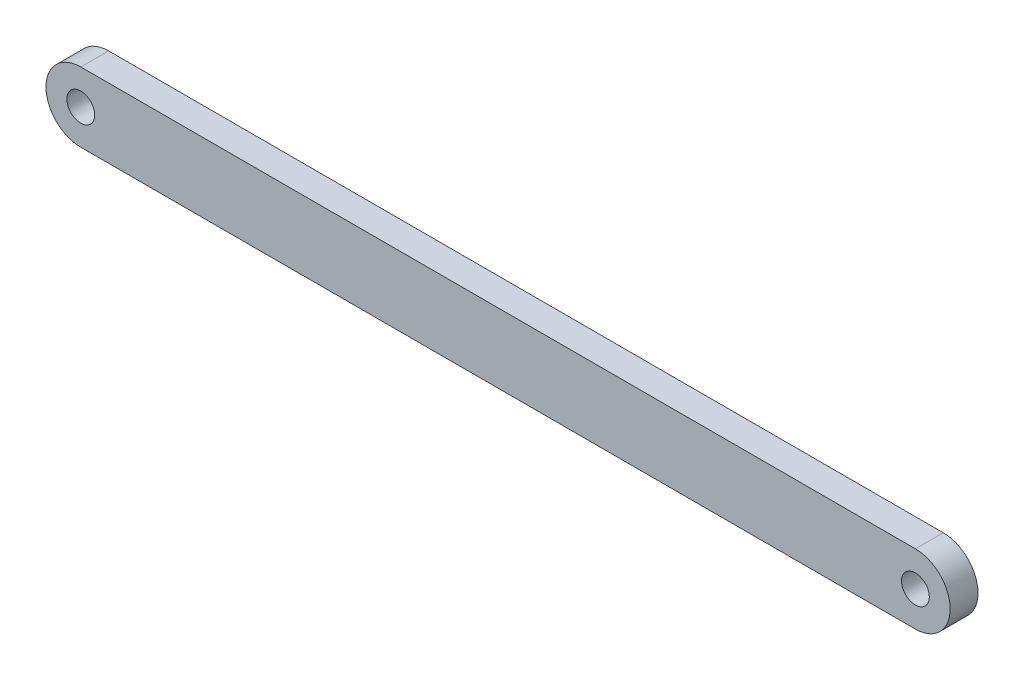
ISO-10303-21;
HEADER;
FILE_DESCRIPTION(('STEP AP214'),'2;1');
FILE_NAME('part.step','',(''),(''),'','','');
FILE_SCHEMA(('AUTOMOTIVE_DESIGN { 1 0 10303 214 1 1 1 1 }'));
ENDSEC;
DATA;
#1=APPLICATION_CONTEXT('core data for automotive mechanical design processes');
#2=APPLICATION_PROTOCOL_DEFINITION('international standard','automotive_design',2000,#1);
#3=PRODUCT_CONTEXT('',#1,'mechanical');
#4=PRODUCT('Part','Part','',(#3));
#5=PRODUCT_RELATED_PRODUCT_CATEGORY('part','',(#4));
#6=PRODUCT_DEFINITION_FORMATION('','',#4);
#7=PRODUCT_DEFINITION_CONTEXT('part definition',#1,'design');
#8=PRODUCT_DEFINITION('design','',#6,#7);
#9=PRODUCT_DEFINITION_SHAPE('','',#8);
#10=(LENGTH_UNIT() NAMED_UNIT(*) SI_UNIT(.MILLI.,.METRE.));
#11=(NAMED_UNIT(*) PLANE_ANGLE_UNIT() SI_UNIT($,.RADIAN.));
#12=(NAMED_UNIT(*) SI_UNIT($,.STERADIAN.) SOLID_ANGLE_UNIT());
#13=UNCERTAINTY_MEASURE_WITH_UNIT(LENGTH_MEASURE(1.E-05),#10,'distance_accuracy_value','');
#14=(GEOMETRIC_REPRESENTATION_CONTEXT(3) GLOBAL_UNCERTAINTY_ASSIGNED_CONTEXT((#13)) GLOBAL_UNIT_ASSIGNED_CONTEXT((#10,
#11,#12)) REPRESENTATION_CONTEXT('',''));
#15=CARTESIAN_POINT('',(0.,0.,0.));
#16=DIRECTION('',(0.,0.,1.));
#17=DIRECTION('',(1.,0.,0.));
#18=AXIS2_PLACEMENT_3D('',#15,#16,#17);
#19=CARTESIAN_POINT('',(-60.0000000000001,0.,4.));
#20=DIRECTION('',(0.,0.,-1.));
#21=DIRECTION('',(-1.,0.,0.));
#22=AXIS2_PLACEMENT_3D('',#19,#20,#21);
#23=CYLINDRICAL_SURFACE('',#22,4.99999999999996);
#24=CARTESIAN_POINT('',(-60.0000000000001,0.,0.));
#25=DIRECTION('',(0.,0.,1.));
#26=DIRECTION('',(1.,0.,0.));
#27=AXIS2_PLACEMENT_3D('',#24,#25,#26);
#28=CIRCLE('',#27,4.99999999999996);
#29=CARTESIAN_POINT('',(-60.0000000000001,4.99999999999996,0.));
#30=VERTEX_POINT('',#29);
#31=CARTESIAN_POINT('',(-60.0000000000001,-4.99999999999996,0.));
#32=VERTEX_POINT('',#31);
#33=EDGE_CURVE('E109',#30,#32,#28,.T.);
#34=ORIENTED_EDGE('',*,*,#33,.T.);
#35=DIRECTION('',(0.,0.,-1.));
#36=VECTOR('',#35,1.);
#37=CARTESIAN_POINT('',(-60.0000000000001,-4.99999999999996,4.));
#38=LINE('',#37,#36);
#39=CARTESIAN_POINT('',(-60.0000000000001,-4.99999999999996,4.));
#40=VERTEX_POINT('',#39);
#41=EDGE_CURVE('E11',#40,#32,#38,.T.);
#42=ORIENTED_EDGE('',*,*,#41,.F.);
#43=CARTESIAN_POINT('',(-60.0000000000001,0.,4.));
#44=DIRECTION('',(0.,0.,1.));
#45=DIRECTION('',(1.,0.,0.));
#46=AXIS2_PLACEMENT_3D('',#43,#44,#45);
#47=CIRCLE('',#46,4.99999999999996);
#48=CARTESIAN_POINT('',(-60.0000000000001,4.99999999999996,4.));
#49=VERTEX_POINT('',#48);
#50=EDGE_CURVE('E79',#49,#40,#47,.T.);
#51=ORIENTED_EDGE('',*,*,#50,.F.);
#52=DIRECTION('',(0.,0.,-1.));
#53=VECTOR('',#52,1.);
#54=CARTESIAN_POINT('',(-60.0000000000001,4.99999999999996,4.));
#55=LINE('',#54,#53);
#56=EDGE_CURVE('E105',#49,#30,#55,.T.);
#57=ORIENTED_EDGE('',*,*,#56,.T.);
#58=EDGE_LOOP('',(#34,#42,#51,#57));
#59=FACE_BOUND('',#58,.T.);
#60=ADVANCED_FACE('F36',(#59),#23,.T.);
#61=CARTESIAN_POINT('',(0.,-4.99999999999992,4.));
#62=DIRECTION('',(0.,-1.,0.));
#63=DIRECTION('',(1.,0.,0.));
#64=AXIS2_PLACEMENT_3D('',#61,#62,#63);
#65=PLANE('',#64);
#66=DIRECTION('',(-1.,0.,0.));
#67=VECTOR('',#66,1.);
#68=CARTESIAN_POINT('',(0.,-4.99999999999992,0.));
#69=LINE('',#68,#67);
#70=CARTESIAN_POINT('',(59.9999999999999,-4.99999999999989,0.));
#71=VERTEX_POINT('',#70);
#72=EDGE_CURVE('E89',#71,#32,#69,.T.);
#73=ORIENTED_EDGE('',*,*,#72,.F.);
#74=DIRECTION('',(0.,0.,-1.));
#75=VECTOR('',#74,1.);
#76=CARTESIAN_POINT('',(59.9999999999999,-4.99999999999989,4.));
#77=LINE('',#76,#75);
#78=CARTESIAN_POINT('',(59.9999999999999,-4.99999999999989,4.));
#79=VERTEX_POINT('',#78);
#80=EDGE_CURVE('E45',#79,#71,#77,.T.);
#81=ORIENTED_EDGE('',*,*,#80,.F.);
#82=DIRECTION('',(-1.,0.,0.));
#83=VECTOR('',#82,1.);
#84=CARTESIAN_POINT('',(0.,-4.99999999999992,4.));
#85=LINE('',#84,#83);
#86=EDGE_CURVE('E87',#79,#40,#85,.T.);
#87=ORIENTED_EDGE('',*,*,#86,.T.);
#88=ORIENTED_EDGE('',*,*,#41,.T.);
#89=EDGE_LOOP('',(#73,#81,#87,#88));
#90=FACE_BOUND('',#89,.T.);
#91=ADVANCED_FACE('F86',(#90),#65,.T.);
#92=CARTESIAN_POINT('',(59.9999999999999,0.,4.));
#93=DIRECTION('',(0.,0.,-1.));
#94=DIRECTION('',(-1.,0.,0.));
#95=AXIS2_PLACEMENT_3D('',#92,#93,#94);
#96=CYLINDRICAL_SURFACE('',#95,4.99999999999995);
#97=CARTESIAN_POINT('',(59.9999999999999,0.,0.));
#98=DIRECTION('',(0.,0.,1.));
#99=DIRECTION('',(1.,0.,0.));
#100=AXIS2_PLACEMENT_3D('',#97,#98,#99);
#101=CIRCLE('',#100,4.99999999999995);
#102=CARTESIAN_POINT('',(59.9999999999999,4.99999999999996,0.));
#103=VERTEX_POINT('',#102);
#104=EDGE_CURVE('E68',#71,#103,#101,.T.);
#105=ORIENTED_EDGE('',*,*,#104,.T.);
#106=DIRECTION('',(0.,0.,-1.));
#107=VECTOR('',#106,1.);
#108=CARTESIAN_POINT('',(59.9999999999999,4.99999999999996,4.));
#109=LINE('',#108,#107);
#110=CARTESIAN_POINT('',(59.9999999999999,4.99999999999996,4.));
#111=VERTEX_POINT('',#110);
#112=EDGE_CURVE('E90',#111,#103,#109,.T.);
#113=ORIENTED_EDGE('',*,*,#112,.F.);
#114=CARTESIAN_POINT('',(59.9999999999999,0.,4.));
#115=DIRECTION('',(0.,0.,1.));
#116=DIRECTION('',(1.,0.,0.));
#117=AXIS2_PLACEMENT_3D('',#114,#115,#116);
#118=CIRCLE('',#117,4.99999999999995);
#119=EDGE_CURVE('E91',#79,#111,#118,.T.);
#120=ORIENTED_EDGE('',*,*,#119,.F.);
#121=ORIENTED_EDGE('',*,*,#80,.T.);
#122=EDGE_LOOP('',(#105,#113,#120,#121));
#123=FACE_BOUND('',#122,.T.);
#124=ADVANCED_FACE('F92',(#123),#96,.T.);
#125=CARTESIAN_POINT('',(0.,4.99999999999996,4.));
#126=DIRECTION('',(0.,-1.,0.));
#127=DIRECTION('',(0.,0.,-1.));
#128=AXIS2_PLACEMENT_3D('',#125,#126,#127);
#129=PLANE('',#128);
#130=DIRECTION('',(-1.,0.,0.));
#131=VECTOR('',#130,1.);
#132=CARTESIAN_POINT('',(0.,4.99999999999996,0.));
#133=LINE('',#132,#131);
#134=EDGE_CURVE('E74',#103,#30,#133,.T.);
#135=ORIENTED_EDGE('',*,*,#134,.T.);
#136=ORIENTED_EDGE('',*,*,#56,.F.);
#137=DIRECTION('',(-1.,0.,0.));
#138=VECTOR('',#137,1.);
#139=CARTESIAN_POINT('',(0.,4.99999999999996,4.));
#140=LINE('',#139,#138);
#141=EDGE_CURVE('E53',#111,#49,#140,.T.);
#142=ORIENTED_EDGE('',*,*,#141,.F.);
#143=ORIENTED_EDGE('',*,*,#112,.T.);
#144=EDGE_LOOP('',(#135,#136,#142,#143));
#145=FACE_BOUND('',#144,.T.);
#146=ADVANCED_FACE('F119',(#145),#129,.F.);
#147=CARTESIAN_POINT('',(59.9999999999999,0.,4.));
#148=DIRECTION('',(0.,0.,-1.));
#149=DIRECTION('',(-1.,0.,0.));
#150=AXIS2_PLACEMENT_3D('',#147,#148,#149);
#151=CYLINDRICAL_SURFACE('',#150,2.);
#152=CARTESIAN_POINT('',(59.9999999999999,0.,4.));
#153=DIRECTION('',(0.,0.,1.));
#154=DIRECTION('',(1.,0.,0.));
#155=AXIS2_PLACEMENT_3D('',#152,#153,#154);
#156=CIRCLE('',#155,2.);
#157=CARTESIAN_POINT('',(61.9999999999999,0.,4.));
#158=VERTEX_POINT('',#157);
#159=EDGE_CURVE('E97',#158,#158,#156,.T.);
#160=ORIENTED_EDGE('',*,*,#159,.T.);
#161=EDGE_LOOP('',(#160));
#162=FACE_BOUND('',#161,.T.);
#163=CARTESIAN_POINT('',(59.9999999999999,0.,0.));
#164=DIRECTION('',(0.,0.,1.));
#165=DIRECTION('',(1.,0.,0.));
#166=AXIS2_PLACEMENT_3D('',#163,#164,#165);
#167=CIRCLE('',#166,2.);
#168=CARTESIAN_POINT('',(61.9999999999999,0.,0.));
#169=VERTEX_POINT('',#168);
#170=EDGE_CURVE('E106',#169,#169,#167,.T.);
#171=ORIENTED_EDGE('',*,*,#170,.F.);
#172=EDGE_LOOP('',(#171));
#173=FACE_BOUND('',#172,.T.);
#174=ADVANCED_FACE('F38',(#162,#173),#151,.F.);
#175=CARTESIAN_POINT('',(-60.0000000000001,0.,4.));
#176=DIRECTION('',(0.,0.,-1.));
#177=DIRECTION('',(-1.,0.,0.));
#178=AXIS2_PLACEMENT_3D('',#175,#176,#177);
#179=CYLINDRICAL_SURFACE('',#178,2.);
#180=CARTESIAN_POINT('',(-60.0000000000001,0.,4.));
#181=DIRECTION('',(0.,0.,1.));
#182=DIRECTION('',(1.,0.,0.));
#183=AXIS2_PLACEMENT_3D('',#180,#181,#182);
#184=CIRCLE('',#183,2.);
#185=CARTESIAN_POINT('',(-58.0000000000001,0.,4.));
#186=VERTEX_POINT('',#185);
#187=EDGE_CURVE('E102',#186,#186,#184,.T.);
#188=ORIENTED_EDGE('',*,*,#187,.T.);
#189=EDGE_LOOP('',(#188));
#190=FACE_BOUND('',#189,.T.);
#191=CARTESIAN_POINT('',(-60.0000000000001,0.,0.));
#192=DIRECTION('',(0.,0.,1.));
#193=DIRECTION('',(1.,0.,0.));
#194=AXIS2_PLACEMENT_3D('',#191,#192,#193);
#195=CIRCLE('',#194,2.);
#196=CARTESIAN_POINT('',(-58.0000000000001,0.,0.));
#197=VERTEX_POINT('',#196);
#198=EDGE_CURVE('E115',#197,#197,#195,.T.);
#199=ORIENTED_EDGE('',*,*,#198,.F.);
#200=EDGE_LOOP('',(#199));
#201=FACE_BOUND('',#200,.T.);
#202=ADVANCED_FACE('F135',(#190,#201),#179,.F.);
#203=CARTESIAN_POINT('',(0.,0.,4.));
#204=DIRECTION('',(0.,0.,1.));
#205=DIRECTION('',(1.,0.,0.));
#206=AXIS2_PLACEMENT_3D('',#203,#204,#205);
#207=PLANE('',#206);
#208=ORIENTED_EDGE('',*,*,#159,.F.);
#209=EDGE_LOOP('',(#208));
#210=FACE_BOUND('',#209,.T.);
#211=ORIENTED_EDGE('',*,*,#50,.T.);
#212=ORIENTED_EDGE('',*,*,#86,.F.);
#213=ORIENTED_EDGE('',*,*,#119,.T.);
#214=ORIENTED_EDGE('',*,*,#141,.T.);
#215=EDGE_LOOP('',(#211,#212,#213,#214));
#216=FACE_BOUND('',#215,.T.);
#217=ORIENTED_EDGE('',*,*,#187,.F.);
#218=EDGE_LOOP('',(#217));
#219=FACE_BOUND('',#218,.T.);
#220=ADVANCED_FACE('F94',(#210,#216,#219),#207,.T.);
#221=CARTESIAN_POINT('',(0.,0.,0.));
#222=DIRECTION('',(0.,0.,1.));
#223=DIRECTION('',(1.,0.,0.));
#224=AXIS2_PLACEMENT_3D('',#221,#222,#223);
#225=PLANE('',#224);
#226=ORIENTED_EDGE('',*,*,#170,.T.);
#227=EDGE_LOOP('',(#226));
#228=FACE_BOUND('',#227,.T.);
#229=ORIENTED_EDGE('',*,*,#33,.F.);
#230=ORIENTED_EDGE('',*,*,#134,.F.);
#231=ORIENTED_EDGE('',*,*,#104,.F.);
#232=ORIENTED_EDGE('',*,*,#72,.T.);
#233=EDGE_LOOP('',(#229,#230,#231,#232));
#234=FACE_BOUND('',#233,.T.);
#235=ORIENTED_EDGE('',*,*,#198,.T.);
#236=EDGE_LOOP('',(#235));
#237=FACE_BOUND('',#236,.T.);
#238=ADVANCED_FACE('F122',(#228,#234,#237),#225,.F.);
#239=CLOSED_SHELL('',(#60,#91,#124,#146,#174,#202,#220,#238));
#240=MANIFOLD_SOLID_BREP('B2',#239);
#241=ADVANCED_BREP_SHAPE_REPRESENTATION('',(#18,#240),#14);
#242=SHAPE_DEFINITION_REPRESENTATION(#9,#241);
ENDSEC;
END-ISO-10303-21;
